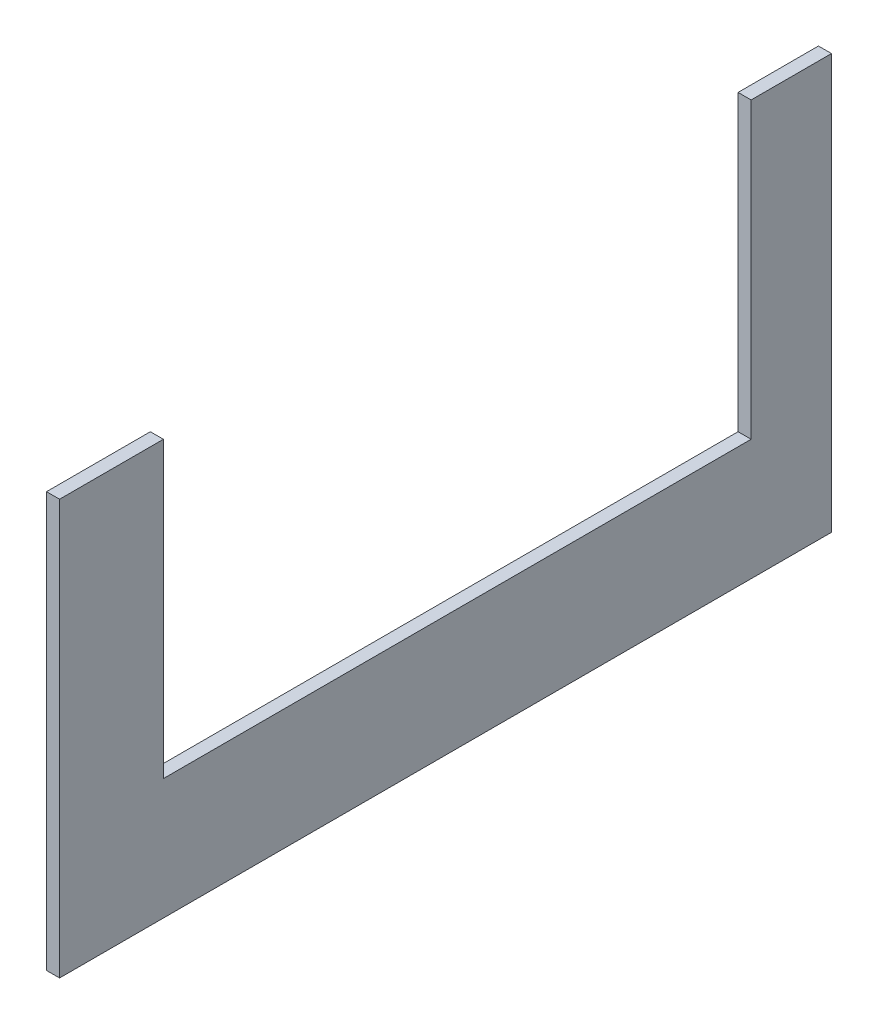
ISO-10303-21;
HEADER;
FILE_DESCRIPTION(('STEP AP214'),'2;1');
FILE_NAME('part.step','',(''),(''),'','','');
FILE_SCHEMA(('AUTOMOTIVE_DESIGN { 1 0 10303 214 1 1 1 1 }'));
ENDSEC;
DATA;
#1=APPLICATION_CONTEXT('core data for automotive mechanical design processes');
#2=APPLICATION_PROTOCOL_DEFINITION('international standard','automotive_design',2000,#1);
#3=PRODUCT_CONTEXT('',#1,'mechanical');
#4=PRODUCT('Part','Part','',(#3));
#5=PRODUCT_RELATED_PRODUCT_CATEGORY('part','',(#4));
#6=PRODUCT_DEFINITION_FORMATION('','',#4);
#7=PRODUCT_DEFINITION_CONTEXT('part definition',#1,'design');
#8=PRODUCT_DEFINITION('design','',#6,#7);
#9=PRODUCT_DEFINITION_SHAPE('','',#8);
#10=(LENGTH_UNIT() NAMED_UNIT(*) SI_UNIT(.MILLI.,.METRE.));
#11=(NAMED_UNIT(*) PLANE_ANGLE_UNIT() SI_UNIT($,.RADIAN.));
#12=(NAMED_UNIT(*) SI_UNIT($,.STERADIAN.) SOLID_ANGLE_UNIT());
#13=UNCERTAINTY_MEASURE_WITH_UNIT(LENGTH_MEASURE(1.E-05),#10,'distance_accuracy_value','');
#14=(GEOMETRIC_REPRESENTATION_CONTEXT(3) GLOBAL_UNCERTAINTY_ASSIGNED_CONTEXT((#13)) GLOBAL_UNIT_ASSIGNED_CONTEXT((#10,
#11,#12)) REPRESENTATION_CONTEXT('',''));
#15=CARTESIAN_POINT('',(0.,0.,0.));
#16=DIRECTION('',(0.,0.,1.));
#17=DIRECTION('',(1.,0.,0.));
#18=AXIS2_PLACEMENT_3D('',#15,#16,#17);
#19=CARTESIAN_POINT('',(605.,-863.497941249595,93.5939560539237));
#20=DIRECTION('',(1.,0.,0.));
#21=DIRECTION('',(0.,1.,0.));
#22=AXIS2_PLACEMENT_3D('',#19,#20,#21);
#23=PLANE('',#22);
#24=DIRECTION('',(0.,-1.,0.));
#25=VECTOR('',#24,1.);
#26=CARTESIAN_POINT('',(605.,-800.,0.));
#27=LINE('',#26,#25);
#28=CARTESIAN_POINT('',(605.,-800.,1.01207930924829E-11));
#29=VERTEX_POINT('',#28);
#30=CARTESIAN_POINT('',(605.,-890.,0.));
#31=VERTEX_POINT('',#30);
#32=EDGE_CURVE('E26',#29,#31,#27,.T.);
#33=ORIENTED_EDGE('',*,*,#32,.F.);
#34=DIRECTION('',(0.,0.,1.));
#35=VECTOR('',#34,1.);
#36=CARTESIAN_POINT('',(605.,-800.,-40.));
#37=LINE('',#36,#35);
#38=CARTESIAN_POINT('',(605.,-800.,-24.6167415301962));
#39=VERTEX_POINT('',#38);
#40=EDGE_CURVE('E144',#39,#29,#37,.T.);
#41=ORIENTED_EDGE('',*,*,#40,.F.);
#42=DIRECTION('',(0.,-1.,0.));
#43=VECTOR('',#42,1.);
#44=CARTESIAN_POINT('',(605.,-800.,-24.6167415301962));
#45=LINE('',#44,#43);
#46=CARTESIAN_POINT('',(605.,-926.995882499191,-24.6167415301962));
#47=VERTEX_POINT('',#46);
#48=EDGE_CURVE('E139',#39,#47,#45,.T.);
#49=ORIENTED_EDGE('',*,*,#48,.T.);
#50=DIRECTION('',(0.,0.,1.));
#51=VECTOR('',#50,1.);
#52=CARTESIAN_POINT('',(605.,-926.995882499191,-24.6167415301962));
#53=LINE('',#52,#51);
#54=CARTESIAN_POINT('',(605.,-926.995882499191,211.804653638044));
#55=VERTEX_POINT('',#54);
#56=EDGE_CURVE('E169',#47,#55,#53,.T.);
#57=ORIENTED_EDGE('',*,*,#56,.T.);
#58=DIRECTION('',(0.,1.,0.));
#59=VECTOR('',#58,1.);
#60=CARTESIAN_POINT('',(605.,-926.995882499191,211.804653638044));
#61=LINE('',#60,#59);
#62=CARTESIAN_POINT('',(605.,-800.,211.804653638044));
#63=VERTEX_POINT('',#62);
#64=EDGE_CURVE('E119',#55,#63,#61,.T.);
#65=ORIENTED_EDGE('',*,*,#64,.T.);
#66=DIRECTION('',(0.,0.,-1.));
#67=VECTOR('',#66,1.);
#68=CARTESIAN_POINT('',(605.,-800.,211.804653638044));
#69=LINE('',#68,#67);
#70=CARTESIAN_POINT('',(605.,-800.,180.));
#71=VERTEX_POINT('',#70);
#72=EDGE_CURVE('E112',#63,#71,#69,.T.);
#73=ORIENTED_EDGE('',*,*,#72,.T.);
#74=DIRECTION('',(0.,1.,0.));
#75=VECTOR('',#74,1.);
#76=CARTESIAN_POINT('',(605.,-890.,180.));
#77=LINE('',#76,#75);
#78=CARTESIAN_POINT('',(605.,-890.,180.));
#79=VERTEX_POINT('',#78);
#80=EDGE_CURVE('E95',#79,#71,#77,.T.);
#81=ORIENTED_EDGE('',*,*,#80,.F.);
#82=DIRECTION('',(0.,0.,1.));
#83=VECTOR('',#82,1.);
#84=CARTESIAN_POINT('',(605.,-890.,0.));
#85=LINE('',#84,#83);
#86=EDGE_CURVE('E160',#31,#79,#85,.T.);
#87=ORIENTED_EDGE('',*,*,#86,.F.);
#88=EDGE_LOOP('',(#33,#41,#49,#57,#65,#73,#81,#87));
#89=FACE_BOUND('',#88,.T.);
#90=ADVANCED_FACE('F16',(#89),#23,.F.);
#91=CARTESIAN_POINT('',(609.,-863.497941249595,93.5939560539237));
#92=DIRECTION('',(1.,0.,0.));
#93=DIRECTION('',(0.,1.,0.));
#94=AXIS2_PLACEMENT_3D('',#91,#92,#93);
#95=PLANE('',#94);
#96=DIRECTION('',(0.,-1.,0.));
#97=VECTOR('',#96,1.);
#98=CARTESIAN_POINT('',(609.,-800.,0.));
#99=LINE('',#98,#97);
#100=CARTESIAN_POINT('',(609.,-800.,1.01207930924829E-11));
#101=VERTEX_POINT('',#100);
#102=CARTESIAN_POINT('',(609.,-890.,0.));
#103=VERTEX_POINT('',#102);
#104=EDGE_CURVE('E11',#101,#103,#99,.T.);
#105=ORIENTED_EDGE('',*,*,#104,.T.);
#106=DIRECTION('',(0.,0.,1.));
#107=VECTOR('',#106,1.);
#108=CARTESIAN_POINT('',(609.,-890.,0.));
#109=LINE('',#108,#107);
#110=CARTESIAN_POINT('',(609.,-890.,180.));
#111=VERTEX_POINT('',#110);
#112=EDGE_CURVE('E161',#103,#111,#109,.T.);
#113=ORIENTED_EDGE('',*,*,#112,.T.);
#114=DIRECTION('',(0.,1.,0.));
#115=VECTOR('',#114,1.);
#116=CARTESIAN_POINT('',(609.,-890.,180.));
#117=LINE('',#116,#115);
#118=CARTESIAN_POINT('',(609.,-800.,180.));
#119=VERTEX_POINT('',#118);
#120=EDGE_CURVE('E107',#111,#119,#117,.T.);
#121=ORIENTED_EDGE('',*,*,#120,.T.);
#122=DIRECTION('',(0.,0.,1.));
#123=VECTOR('',#122,1.);
#124=CARTESIAN_POINT('',(609.,-800.,211.804653638044));
#125=LINE('',#124,#123);
#126=CARTESIAN_POINT('',(609.,-800.,211.804653638044));
#127=VERTEX_POINT('',#126);
#128=EDGE_CURVE('E114',#119,#127,#125,.T.);
#129=ORIENTED_EDGE('',*,*,#128,.T.);
#130=DIRECTION('',(0.,-1.,0.));
#131=VECTOR('',#130,1.);
#132=CARTESIAN_POINT('',(609.,-926.995882499191,211.804653638044));
#133=LINE('',#132,#131);
#134=CARTESIAN_POINT('',(609.,-926.995882499191,211.804653638044));
#135=VERTEX_POINT('',#134);
#136=EDGE_CURVE('E129',#127,#135,#133,.T.);
#137=ORIENTED_EDGE('',*,*,#136,.T.);
#138=DIRECTION('',(0.,0.,-1.));
#139=VECTOR('',#138,1.);
#140=CARTESIAN_POINT('',(609.,-926.995882499191,-24.6167415301962));
#141=LINE('',#140,#139);
#142=CARTESIAN_POINT('',(609.,-926.995882499191,-24.6167415301962));
#143=VERTEX_POINT('',#142);
#144=EDGE_CURVE('E19',#135,#143,#141,.T.);
#145=ORIENTED_EDGE('',*,*,#144,.T.);
#146=DIRECTION('',(0.,1.,0.));
#147=VECTOR('',#146,1.);
#148=CARTESIAN_POINT('',(609.,-800.,-24.6167415301962));
#149=LINE('',#148,#147);
#150=CARTESIAN_POINT('',(609.,-800.,-24.6167415301962));
#151=VERTEX_POINT('',#150);
#152=EDGE_CURVE('E135',#143,#151,#149,.T.);
#153=ORIENTED_EDGE('',*,*,#152,.T.);
#154=DIRECTION('',(0.,0.,1.));
#155=VECTOR('',#154,1.);
#156=CARTESIAN_POINT('',(609.,-800.,-40.));
#157=LINE('',#156,#155);
#158=EDGE_CURVE('E133',#151,#101,#157,.T.);
#159=ORIENTED_EDGE('',*,*,#158,.T.);
#160=EDGE_LOOP('',(#105,#113,#121,#129,#137,#145,#153,#159));
#161=FACE_BOUND('',#160,.T.);
#162=ADVANCED_FACE('F206',(#161),#95,.T.);
#163=CARTESIAN_POINT('',(605.,-800.,0.));
#164=DIRECTION('',(0.,0.,1.));
#165=DIRECTION('',(1.,0.,0.));
#166=AXIS2_PLACEMENT_3D('',#163,#164,#165);
#167=PLANE('',#166);
#168=ORIENTED_EDGE('',*,*,#32,.T.);
#169=DIRECTION('',(1.,0.,0.));
#170=VECTOR('',#169,1.);
#171=CARTESIAN_POINT('',(605.,-890.,0.));
#172=LINE('',#171,#170);
#173=EDGE_CURVE('E164',#31,#103,#172,.T.);
#174=ORIENTED_EDGE('',*,*,#173,.T.);
#175=ORIENTED_EDGE('',*,*,#104,.F.);
#176=DIRECTION('',(1.,0.,0.));
#177=VECTOR('',#176,1.);
#178=CARTESIAN_POINT('',(605.,-800.,1.01207930924829E-11));
#179=LINE('',#178,#177);
#180=EDGE_CURVE('E140',#29,#101,#179,.T.);
#181=ORIENTED_EDGE('',*,*,#180,.F.);
#182=EDGE_LOOP('',(#168,#174,#175,#181));
#183=FACE_BOUND('',#182,.T.);
#184=ADVANCED_FACE('F188',(#183),#167,.T.);
#185=CARTESIAN_POINT('',(605.,-890.,0.));
#186=DIRECTION('',(0.,1.,0.));
#187=DIRECTION('',(1.,0.,0.));
#188=AXIS2_PLACEMENT_3D('',#185,#186,#187);
#189=PLANE('',#188);
#190=ORIENTED_EDGE('',*,*,#86,.T.);
#191=DIRECTION('',(1.,0.,0.));
#192=VECTOR('',#191,1.);
#193=CARTESIAN_POINT('',(605.,-890.,180.));
#194=LINE('',#193,#192);
#195=EDGE_CURVE('E102',#79,#111,#194,.T.);
#196=ORIENTED_EDGE('',*,*,#195,.T.);
#197=ORIENTED_EDGE('',*,*,#112,.F.);
#198=ORIENTED_EDGE('',*,*,#173,.F.);
#199=EDGE_LOOP('',(#190,#196,#197,#198));
#200=FACE_BOUND('',#199,.T.);
#201=ADVANCED_FACE('F183',(#200),#189,.T.);
#202=CARTESIAN_POINT('',(605.,-890.,180.));
#203=DIRECTION('',(0.,0.,-1.));
#204=DIRECTION('',(0.,-1.,0.));
#205=AXIS2_PLACEMENT_3D('',#202,#203,#204);
#206=PLANE('',#205);
#207=ORIENTED_EDGE('',*,*,#80,.T.);
#208=DIRECTION('',(1.,0.,0.));
#209=VECTOR('',#208,1.);
#210=CARTESIAN_POINT('',(605.,-800.,180.));
#211=LINE('',#210,#209);
#212=EDGE_CURVE('E99',#71,#119,#211,.T.);
#213=ORIENTED_EDGE('',*,*,#212,.T.);
#214=ORIENTED_EDGE('',*,*,#120,.F.);
#215=ORIENTED_EDGE('',*,*,#195,.F.);
#216=EDGE_LOOP('',(#207,#213,#214,#215));
#217=FACE_BOUND('',#216,.T.);
#218=ADVANCED_FACE('F97',(#217),#206,.T.);
#219=CARTESIAN_POINT('',(605.,-800.,180.));
#220=DIRECTION('',(0.,1.,0.));
#221=DIRECTION('',(0.,0.,-1.));
#222=AXIS2_PLACEMENT_3D('',#219,#220,#221);
#223=PLANE('',#222);
#224=ORIENTED_EDGE('',*,*,#72,.F.);
#225=DIRECTION('',(1.,0.,0.));
#226=VECTOR('',#225,1.);
#227=CARTESIAN_POINT('',(605.,-800.,211.804653638044));
#228=LINE('',#227,#226);
#229=EDGE_CURVE('E121',#63,#127,#228,.T.);
#230=ORIENTED_EDGE('',*,*,#229,.T.);
#231=ORIENTED_EDGE('',*,*,#128,.F.);
#232=ORIENTED_EDGE('',*,*,#212,.F.);
#233=EDGE_LOOP('',(#224,#230,#231,#232));
#234=FACE_BOUND('',#233,.T.);
#235=ADVANCED_FACE('F110',(#234),#223,.T.);
#236=CARTESIAN_POINT('',(605.,-800.,211.804653638044));
#237=DIRECTION('',(0.,0.,1.));
#238=DIRECTION('',(1.,0.,0.));
#239=AXIS2_PLACEMENT_3D('',#236,#237,#238);
#240=PLANE('',#239);
#241=ORIENTED_EDGE('',*,*,#64,.F.);
#242=DIRECTION('',(1.,0.,0.));
#243=VECTOR('',#242,1.);
#244=CARTESIAN_POINT('',(605.,-926.995882499191,211.804653638044));
#245=LINE('',#244,#243);
#246=EDGE_CURVE('E147',#55,#135,#245,.T.);
#247=ORIENTED_EDGE('',*,*,#246,.T.);
#248=ORIENTED_EDGE('',*,*,#136,.F.);
#249=ORIENTED_EDGE('',*,*,#229,.F.);
#250=EDGE_LOOP('',(#241,#247,#248,#249));
#251=FACE_BOUND('',#250,.T.);
#252=ADVANCED_FACE('F205',(#251),#240,.T.);
#253=CARTESIAN_POINT('',(605.,-926.995882499191,211.804653638044));
#254=DIRECTION('',(0.,-1.,0.));
#255=DIRECTION('',(0.,0.,-1.));
#256=AXIS2_PLACEMENT_3D('',#253,#254,#255);
#257=PLANE('',#256);
#258=ORIENTED_EDGE('',*,*,#56,.F.);
#259=DIRECTION('',(1.,0.,0.));
#260=VECTOR('',#259,1.);
#261=CARTESIAN_POINT('',(605.,-926.995882499191,-24.6167415301962));
#262=LINE('',#261,#260);
#263=EDGE_CURVE('E138',#47,#143,#262,.T.);
#264=ORIENTED_EDGE('',*,*,#263,.T.);
#265=ORIENTED_EDGE('',*,*,#144,.F.);
#266=ORIENTED_EDGE('',*,*,#246,.F.);
#267=EDGE_LOOP('',(#258,#264,#265,#266));
#268=FACE_BOUND('',#267,.T.);
#269=ADVANCED_FACE('F200',(#268),#257,.T.);
#270=CARTESIAN_POINT('',(605.,-926.995882499191,-24.6167415301962));
#271=DIRECTION('',(0.,0.,-1.));
#272=DIRECTION('',(0.,-1.,0.));
#273=AXIS2_PLACEMENT_3D('',#270,#271,#272);
#274=PLANE('',#273);
#275=ORIENTED_EDGE('',*,*,#48,.F.);
#276=DIRECTION('',(1.,0.,0.));
#277=VECTOR('',#276,1.);
#278=CARTESIAN_POINT('',(605.,-800.,-24.6167415301962));
#279=LINE('',#278,#277);
#280=EDGE_CURVE('E153',#39,#151,#279,.T.);
#281=ORIENTED_EDGE('',*,*,#280,.T.);
#282=ORIENTED_EDGE('',*,*,#152,.F.);
#283=ORIENTED_EDGE('',*,*,#263,.F.);
#284=EDGE_LOOP('',(#275,#281,#282,#283));
#285=FACE_BOUND('',#284,.T.);
#286=ADVANCED_FACE('F195',(#285),#274,.T.);
#287=CARTESIAN_POINT('',(605.,-800.,-24.6167415301962));
#288=DIRECTION('',(0.,1.,0.));
#289=DIRECTION('',(0.,0.,-1.));
#290=AXIS2_PLACEMENT_3D('',#287,#288,#289);
#291=PLANE('',#290);
#292=ORIENTED_EDGE('',*,*,#40,.T.);
#293=ORIENTED_EDGE('',*,*,#180,.T.);
#294=ORIENTED_EDGE('',*,*,#158,.F.);
#295=ORIENTED_EDGE('',*,*,#280,.F.);
#296=EDGE_LOOP('',(#292,#293,#294,#295));
#297=FACE_BOUND('',#296,.T.);
#298=ADVANCED_FACE('F192',(#297),#291,.T.);
#299=CLOSED_SHELL('',(#90,#162,#184,#201,#218,#235,#252,#269,#286,#298));
#300=MANIFOLD_SOLID_BREP('B1',#299);
#301=ADVANCED_BREP_SHAPE_REPRESENTATION('',(#18,#300),#14);
#302=SHAPE_DEFINITION_REPRESENTATION(#9,#301);
ENDSEC;
END-ISO-10303-21;
